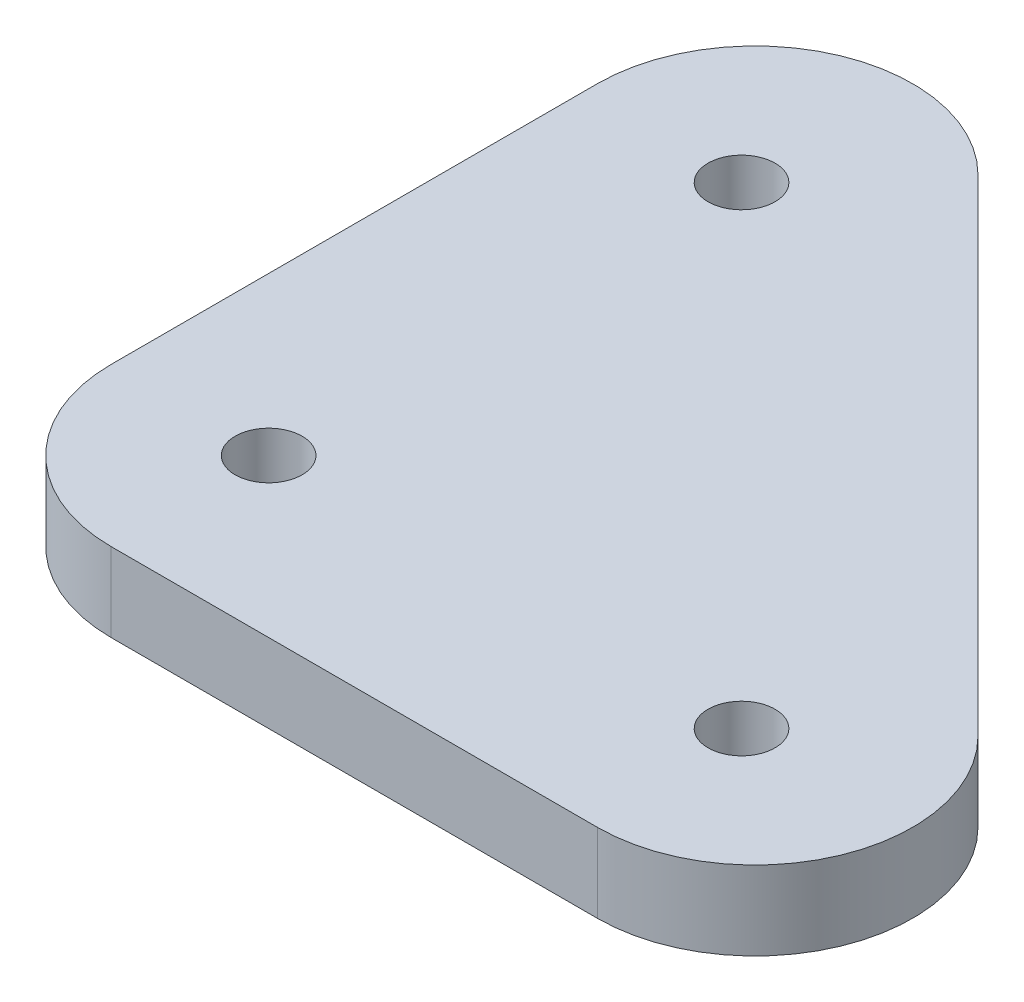
ISO-10303-21;
HEADER;
FILE_DESCRIPTION(('STEP AP214'),'2;1');
FILE_NAME('part.step','',(''),(''),'','','');
FILE_SCHEMA(('AUTOMOTIVE_DESIGN { 1 0 10303 214 1 1 1 1 }'));
ENDSEC;
DATA;
#1=APPLICATION_CONTEXT('core data for automotive mechanical design processes');
#2=APPLICATION_PROTOCOL_DEFINITION('international standard','automotive_design',2000,#1);
#3=PRODUCT_CONTEXT('',#1,'mechanical');
#4=PRODUCT('Part','Part','',(#3));
#5=PRODUCT_RELATED_PRODUCT_CATEGORY('part','',(#4));
#6=PRODUCT_DEFINITION_FORMATION('','',#4);
#7=PRODUCT_DEFINITION_CONTEXT('part definition',#1,'design');
#8=PRODUCT_DEFINITION('design','',#6,#7);
#9=PRODUCT_DEFINITION_SHAPE('','',#8);
#10=(LENGTH_UNIT() NAMED_UNIT(*) SI_UNIT(.MILLI.,.METRE.));
#11=(NAMED_UNIT(*) PLANE_ANGLE_UNIT() SI_UNIT($,.RADIAN.));
#12=(NAMED_UNIT(*) SI_UNIT($,.STERADIAN.) SOLID_ANGLE_UNIT());
#13=UNCERTAINTY_MEASURE_WITH_UNIT(LENGTH_MEASURE(1.E-05),#10,'distance_accuracy_value','');
#14=(GEOMETRIC_REPRESENTATION_CONTEXT(3) GLOBAL_UNCERTAINTY_ASSIGNED_CONTEXT((#13)) GLOBAL_UNIT_ASSIGNED_CONTEXT((#10,
#11,#12)) REPRESENTATION_CONTEXT('',''));
#15=CARTESIAN_POINT('',(0.,0.,0.));
#16=DIRECTION('',(0.,0.,1.));
#17=DIRECTION('',(1.,0.,0.));
#18=AXIS2_PLACEMENT_3D('',#15,#16,#17);
#19=CARTESIAN_POINT('',(40.857864376269,5.,-10.));
#20=DIRECTION('',(0.,-1.,0.));
#21=DIRECTION('',(0.,0.,-1.));
#22=AXIS2_PLACEMENT_3D('',#19,#20,#21);
#23=PLANE('',#22);
#24=CARTESIAN_POINT('',(40.857864376269,5.,-10.));
#25=DIRECTION('',(0.,1.,0.));
#26=DIRECTION('',(0.,0.,-1.));
#27=AXIS2_PLACEMENT_3D('',#24,#25,#26);
#28=CIRCLE('',#27,10.);
#29=CARTESIAN_POINT('',(40.857864376269,5.,0.));
#30=VERTEX_POINT('',#29);
#31=CARTESIAN_POINT('',(47.9289321881345,5.,-17.0710678118655));
#32=VERTEX_POINT('',#31);
#33=EDGE_CURVE('E129',#30,#32,#28,.T.);
#34=ORIENTED_EDGE('',*,*,#33,.T.);
#35=DIRECTION('',(-0.707106781186547,0.,-0.707106781186547));
#36=VECTOR('',#35,1.);
#37=CARTESIAN_POINT('',(17.0710678118655,5.,-47.9289321881345));
#38=LINE('',#37,#36);
#39=CARTESIAN_POINT('',(17.0710678118655,5.,-47.9289321881345));
#40=VERTEX_POINT('',#39);
#41=EDGE_CURVE('E87',#32,#40,#38,.T.);
#42=ORIENTED_EDGE('',*,*,#41,.T.);
#43=CARTESIAN_POINT('',(10.,5.,-40.857864376269));
#44=DIRECTION('',(0.,1.,0.));
#45=DIRECTION('',(0.,0.,-1.));
#46=AXIS2_PLACEMENT_3D('',#43,#44,#45);
#47=CIRCLE('',#46,10.);
#48=CARTESIAN_POINT('',(0.,5.,-40.857864376269));
#49=VERTEX_POINT('',#48);
#50=EDGE_CURVE('E100',#40,#49,#47,.T.);
#51=ORIENTED_EDGE('',*,*,#50,.T.);
#52=DIRECTION('',(0.,0.,1.));
#53=VECTOR('',#52,1.);
#54=CARTESIAN_POINT('',(0.,5.,-9.99999999999999));
#55=LINE('',#54,#53);
#56=CARTESIAN_POINT('',(0.,5.,-9.99999999999999));
#57=VERTEX_POINT('',#56);
#58=EDGE_CURVE('E94',#49,#57,#55,.T.);
#59=ORIENTED_EDGE('',*,*,#58,.T.);
#60=CARTESIAN_POINT('',(10.,5.,-9.99999999999999));
#61=DIRECTION('',(0.,1.,0.));
#62=DIRECTION('',(0.,0.,1.));
#63=AXIS2_PLACEMENT_3D('',#60,#61,#62);
#64=CIRCLE('',#63,10.);
#65=CARTESIAN_POINT('',(10.,5.,0.));
#66=VERTEX_POINT('',#65);
#67=EDGE_CURVE('E98',#57,#66,#64,.T.);
#68=ORIENTED_EDGE('',*,*,#67,.T.);
#69=DIRECTION('',(1.,0.,0.));
#70=VECTOR('',#69,1.);
#71=CARTESIAN_POINT('',(40.857864376269,5.,0.));
#72=LINE('',#71,#70);
#73=EDGE_CURVE('E50',#66,#30,#72,.T.);
#74=ORIENTED_EDGE('',*,*,#73,.T.);
#75=EDGE_LOOP('',(#34,#42,#51,#59,#68,#74));
#76=FACE_BOUND('',#75,.T.);
#77=CARTESIAN_POINT('',(10.,5.,-10.));
#78=DIRECTION('',(0.,1.,0.));
#79=DIRECTION('',(0.,0.,1.));
#80=AXIS2_PLACEMENT_3D('',#77,#78,#79);
#81=CIRCLE('',#80,2.125);
#82=CARTESIAN_POINT('',(10.,5.,-7.875));
#83=VERTEX_POINT('',#82);
#84=EDGE_CURVE('E122',#83,#83,#81,.T.);
#85=ORIENTED_EDGE('',*,*,#84,.F.);
#86=EDGE_LOOP('',(#85));
#87=FACE_BOUND('',#86,.T.);
#88=CARTESIAN_POINT('',(10.,5.,-40.));
#89=DIRECTION('',(0.,1.,0.));
#90=DIRECTION('',(0.,0.,1.));
#91=AXIS2_PLACEMENT_3D('',#88,#89,#90);
#92=CIRCLE('',#91,2.125);
#93=CARTESIAN_POINT('',(10.,5.,-37.875));
#94=VERTEX_POINT('',#93);
#95=EDGE_CURVE('E183',#94,#94,#92,.T.);
#96=ORIENTED_EDGE('',*,*,#95,.F.);
#97=EDGE_LOOP('',(#96));
#98=FACE_BOUND('',#97,.T.);
#99=CARTESIAN_POINT('',(40.,5.,-10.));
#100=DIRECTION('',(0.,1.,0.));
#101=DIRECTION('',(0.,0.,1.));
#102=AXIS2_PLACEMENT_3D('',#99,#100,#101);
#103=CIRCLE('',#102,2.125);
#104=CARTESIAN_POINT('',(40.,5.,-7.87499999999999));
#105=VERTEX_POINT('',#104);
#106=EDGE_CURVE('E174',#105,#105,#103,.T.);
#107=ORIENTED_EDGE('',*,*,#106,.F.);
#108=EDGE_LOOP('',(#107));
#109=FACE_BOUND('',#108,.T.);
#110=ADVANCED_FACE('F33',(#76,#87,#98,#109),#23,.F.);
#111=CARTESIAN_POINT('',(40.857864376269,0.,-10.));
#112=DIRECTION('',(0.,-1.,0.));
#113=DIRECTION('',(0.,0.,-1.));
#114=AXIS2_PLACEMENT_3D('',#111,#112,#113);
#115=PLANE('',#114);
#116=CARTESIAN_POINT('',(10.,0.,-40.));
#117=DIRECTION('',(0.,1.,0.));
#118=DIRECTION('',(0.,0.,1.));
#119=AXIS2_PLACEMENT_3D('',#116,#117,#118);
#120=CIRCLE('',#119,2.125);
#121=CARTESIAN_POINT('',(10.,0.,-37.875));
#122=VERTEX_POINT('',#121);
#123=EDGE_CURVE('E180',#122,#122,#120,.T.);
#124=ORIENTED_EDGE('',*,*,#123,.T.);
#125=EDGE_LOOP('',(#124));
#126=FACE_BOUND('',#125,.T.);
#127=CARTESIAN_POINT('',(40.857864376269,0.,-10.));
#128=DIRECTION('',(0.,1.,0.));
#129=DIRECTION('',(0.,0.,-1.));
#130=AXIS2_PLACEMENT_3D('',#127,#128,#129);
#131=CIRCLE('',#130,10.);
#132=CARTESIAN_POINT('',(40.857864376269,0.,0.));
#133=VERTEX_POINT('',#132);
#134=CARTESIAN_POINT('',(47.9289321881345,0.,-17.0710678118655));
#135=VERTEX_POINT('',#134);
#136=EDGE_CURVE('E118',#133,#135,#131,.T.);
#137=ORIENTED_EDGE('',*,*,#136,.F.);
#138=DIRECTION('',(1.,0.,0.));
#139=VECTOR('',#138,1.);
#140=CARTESIAN_POINT('',(40.857864376269,0.,0.));
#141=LINE('',#140,#139);
#142=CARTESIAN_POINT('',(10.,0.,0.));
#143=VERTEX_POINT('',#142);
#144=EDGE_CURVE('E79',#143,#133,#141,.T.);
#145=ORIENTED_EDGE('',*,*,#144,.F.);
#146=CARTESIAN_POINT('',(10.,0.,-9.99999999999999));
#147=DIRECTION('',(0.,1.,0.));
#148=DIRECTION('',(0.,0.,1.));
#149=AXIS2_PLACEMENT_3D('',#146,#147,#148);
#150=CIRCLE('',#149,10.);
#151=CARTESIAN_POINT('',(0.,0.,-9.99999999999999));
#152=VERTEX_POINT('',#151);
#153=EDGE_CURVE('E73',#152,#143,#150,.T.);
#154=ORIENTED_EDGE('',*,*,#153,.F.);
#155=DIRECTION('',(0.,0.,1.));
#156=VECTOR('',#155,1.);
#157=CARTESIAN_POINT('',(0.,0.,-9.99999999999999));
#158=LINE('',#157,#156);
#159=CARTESIAN_POINT('',(0.,0.,-40.857864376269));
#160=VERTEX_POINT('',#159);
#161=EDGE_CURVE('E108',#160,#152,#158,.T.);
#162=ORIENTED_EDGE('',*,*,#161,.F.);
#163=CARTESIAN_POINT('',(10.,0.,-40.857864376269));
#164=DIRECTION('',(0.,1.,0.));
#165=DIRECTION('',(0.,0.,-1.));
#166=AXIS2_PLACEMENT_3D('',#163,#164,#165);
#167=CIRCLE('',#166,10.);
#168=CARTESIAN_POINT('',(17.0710678118655,0.,-47.9289321881345));
#169=VERTEX_POINT('',#168);
#170=EDGE_CURVE('E124',#169,#160,#167,.T.);
#171=ORIENTED_EDGE('',*,*,#170,.F.);
#172=DIRECTION('',(-0.707106781186547,0.,-0.707106781186547));
#173=VECTOR('',#172,1.);
#174=CARTESIAN_POINT('',(17.0710678118655,0.,-47.9289321881345));
#175=LINE('',#174,#173);
#176=EDGE_CURVE('E121',#135,#169,#175,.T.);
#177=ORIENTED_EDGE('',*,*,#176,.F.);
#178=EDGE_LOOP('',(#137,#145,#154,#162,#171,#177));
#179=FACE_BOUND('',#178,.T.);
#180=CARTESIAN_POINT('',(10.,0.,-10.));
#181=DIRECTION('',(0.,1.,0.));
#182=DIRECTION('',(0.,0.,1.));
#183=AXIS2_PLACEMENT_3D('',#180,#181,#182);
#184=CIRCLE('',#183,2.125);
#185=CARTESIAN_POINT('',(10.,0.,-7.875));
#186=VERTEX_POINT('',#185);
#187=EDGE_CURVE('E186',#186,#186,#184,.T.);
#188=ORIENTED_EDGE('',*,*,#187,.T.);
#189=EDGE_LOOP('',(#188));
#190=FACE_BOUND('',#189,.T.);
#191=CARTESIAN_POINT('',(40.,0.,-10.));
#192=DIRECTION('',(0.,1.,0.));
#193=DIRECTION('',(0.,0.,1.));
#194=AXIS2_PLACEMENT_3D('',#191,#192,#193);
#195=CIRCLE('',#194,2.125);
#196=CARTESIAN_POINT('',(40.,0.,-7.87499999999999));
#197=VERTEX_POINT('',#196);
#198=EDGE_CURVE('E177',#197,#197,#195,.T.);
#199=ORIENTED_EDGE('',*,*,#198,.T.);
#200=EDGE_LOOP('',(#199));
#201=FACE_BOUND('',#200,.T.);
#202=ADVANCED_FACE('F138',(#126,#179,#190,#201),#115,.T.);
#203=CARTESIAN_POINT('',(40.857864376269,5.,-10.));
#204=DIRECTION('',(0.,-1.,0.));
#205=DIRECTION('',(0.,0.,-1.));
#206=AXIS2_PLACEMENT_3D('',#203,#204,#205);
#207=CYLINDRICAL_SURFACE('',#206,10.);
#208=ORIENTED_EDGE('',*,*,#136,.T.);
#209=DIRECTION('',(0.,-1.,0.));
#210=VECTOR('',#209,1.);
#211=CARTESIAN_POINT('',(47.9289321881345,5.,-17.0710678118655));
#212=LINE('',#211,#210);
#213=EDGE_CURVE('E11',#32,#135,#212,.T.);
#214=ORIENTED_EDGE('',*,*,#213,.F.);
#215=ORIENTED_EDGE('',*,*,#33,.F.);
#216=DIRECTION('',(0.,-1.,0.));
#217=VECTOR('',#216,1.);
#218=CARTESIAN_POINT('',(40.857864376269,5.,0.));
#219=LINE('',#218,#217);
#220=EDGE_CURVE('E114',#30,#133,#219,.T.);
#221=ORIENTED_EDGE('',*,*,#220,.T.);
#222=EDGE_LOOP('',(#208,#214,#215,#221));
#223=FACE_BOUND('',#222,.T.);
#224=ADVANCED_FACE('F35',(#223),#207,.T.);
#225=CARTESIAN_POINT('',(17.0710678118655,5.,-47.9289321881345));
#226=DIRECTION('',(-0.707106781186548,0.,0.707106781186548));
#227=DIRECTION('',(0.707106781186548,0.,0.707106781186548));
#228=AXIS2_PLACEMENT_3D('',#225,#226,#227);
#229=PLANE('',#228);
#230=ORIENTED_EDGE('',*,*,#176,.T.);
#231=DIRECTION('',(0.,-1.,0.));
#232=VECTOR('',#231,1.);
#233=CARTESIAN_POINT('',(17.0710678118655,5.,-47.9289321881345));
#234=LINE('',#233,#232);
#235=EDGE_CURVE('E42',#40,#169,#234,.T.);
#236=ORIENTED_EDGE('',*,*,#235,.F.);
#237=ORIENTED_EDGE('',*,*,#41,.F.);
#238=ORIENTED_EDGE('',*,*,#213,.T.);
#239=EDGE_LOOP('',(#230,#236,#237,#238));
#240=FACE_BOUND('',#239,.T.);
#241=ADVANCED_FACE('F237',(#240),#229,.F.);
#242=CARTESIAN_POINT('',(10.,5.,-40.857864376269));
#243=DIRECTION('',(0.,-1.,0.));
#244=DIRECTION('',(0.,0.,-1.));
#245=AXIS2_PLACEMENT_3D('',#242,#243,#244);
#246=CYLINDRICAL_SURFACE('',#245,10.);
#247=ORIENTED_EDGE('',*,*,#170,.T.);
#248=DIRECTION('',(0.,-1.,0.));
#249=VECTOR('',#248,1.);
#250=CARTESIAN_POINT('',(0.,5.,-40.857864376269));
#251=LINE('',#250,#249);
#252=EDGE_CURVE('E109',#49,#160,#251,.T.);
#253=ORIENTED_EDGE('',*,*,#252,.F.);
#254=ORIENTED_EDGE('',*,*,#50,.F.);
#255=ORIENTED_EDGE('',*,*,#235,.T.);
#256=EDGE_LOOP('',(#247,#253,#254,#255));
#257=FACE_BOUND('',#256,.T.);
#258=ADVANCED_FACE('F135',(#257),#246,.T.);
#259=CARTESIAN_POINT('',(0.,5.,-9.99999999999999));
#260=DIRECTION('',(1.,0.,0.));
#261=DIRECTION('',(0.,0.,-1.));
#262=AXIS2_PLACEMENT_3D('',#259,#260,#261);
#263=PLANE('',#262);
#264=ORIENTED_EDGE('',*,*,#161,.T.);
#265=DIRECTION('',(0.,-1.,0.));
#266=VECTOR('',#265,1.);
#267=CARTESIAN_POINT('',(0.,5.,-9.99999999999999));
#268=LINE('',#267,#266);
#269=EDGE_CURVE('E105',#57,#152,#268,.T.);
#270=ORIENTED_EDGE('',*,*,#269,.F.);
#271=ORIENTED_EDGE('',*,*,#58,.F.);
#272=ORIENTED_EDGE('',*,*,#252,.T.);
#273=EDGE_LOOP('',(#264,#270,#271,#272));
#274=FACE_BOUND('',#273,.T.);
#275=ADVANCED_FACE('F106',(#274),#263,.F.);
#276=CARTESIAN_POINT('',(10.,5.,-9.99999999999999));
#277=DIRECTION('',(0.,-1.,0.));
#278=DIRECTION('',(0.,0.,-1.));
#279=AXIS2_PLACEMENT_3D('',#276,#277,#278);
#280=CYLINDRICAL_SURFACE('',#279,10.);
#281=ORIENTED_EDGE('',*,*,#153,.T.);
#282=DIRECTION('',(0.,-1.,0.));
#283=VECTOR('',#282,1.);
#284=CARTESIAN_POINT('',(10.,5.,0.));
#285=LINE('',#284,#283);
#286=EDGE_CURVE('E110',#66,#143,#285,.T.);
#287=ORIENTED_EDGE('',*,*,#286,.F.);
#288=ORIENTED_EDGE('',*,*,#67,.F.);
#289=ORIENTED_EDGE('',*,*,#269,.T.);
#290=EDGE_LOOP('',(#281,#287,#288,#289));
#291=FACE_BOUND('',#290,.T.);
#292=ADVANCED_FACE('F112',(#291),#280,.T.);
#293=CARTESIAN_POINT('',(40.857864376269,5.,0.));
#294=DIRECTION('',(0.,0.,-1.));
#295=DIRECTION('',(-1.,0.,0.));
#296=AXIS2_PLACEMENT_3D('',#293,#294,#295);
#297=PLANE('',#296);
#298=ORIENTED_EDGE('',*,*,#144,.T.);
#299=ORIENTED_EDGE('',*,*,#220,.F.);
#300=ORIENTED_EDGE('',*,*,#73,.F.);
#301=ORIENTED_EDGE('',*,*,#286,.T.);
#302=EDGE_LOOP('',(#298,#299,#300,#301));
#303=FACE_BOUND('',#302,.T.);
#304=ADVANCED_FACE('F143',(#303),#297,.F.);
#305=CARTESIAN_POINT('',(10.,5.,-10.));
#306=DIRECTION('',(0.,-1.,0.));
#307=DIRECTION('',(0.,0.,-1.));
#308=AXIS2_PLACEMENT_3D('',#305,#306,#307);
#309=CYLINDRICAL_SURFACE('',#308,2.125);
#310=ORIENTED_EDGE('',*,*,#84,.T.);
#311=EDGE_LOOP('',(#310));
#312=FACE_BOUND('',#311,.T.);
#313=ORIENTED_EDGE('',*,*,#187,.F.);
#314=EDGE_LOOP('',(#313));
#315=FACE_BOUND('',#314,.T.);
#316=ADVANCED_FACE('F145',(#312,#315),#309,.F.);
#317=CARTESIAN_POINT('',(10.,5.,-40.));
#318=DIRECTION('',(0.,-1.,0.));
#319=DIRECTION('',(0.,0.,-1.));
#320=AXIS2_PLACEMENT_3D('',#317,#318,#319);
#321=CYLINDRICAL_SURFACE('',#320,2.125);
#322=ORIENTED_EDGE('',*,*,#95,.T.);
#323=EDGE_LOOP('',(#322));
#324=FACE_BOUND('',#323,.T.);
#325=ORIENTED_EDGE('',*,*,#123,.F.);
#326=EDGE_LOOP('',(#325));
#327=FACE_BOUND('',#326,.T.);
#328=ADVANCED_FACE('F151',(#324,#327),#321,.F.);
#329=CARTESIAN_POINT('',(40.,5.,-10.));
#330=DIRECTION('',(0.,-1.,0.));
#331=DIRECTION('',(0.,0.,-1.));
#332=AXIS2_PLACEMENT_3D('',#329,#330,#331);
#333=CYLINDRICAL_SURFACE('',#332,2.125);
#334=ORIENTED_EDGE('',*,*,#106,.T.);
#335=EDGE_LOOP('',(#334));
#336=FACE_BOUND('',#335,.T.);
#337=ORIENTED_EDGE('',*,*,#198,.F.);
#338=EDGE_LOOP('',(#337));
#339=FACE_BOUND('',#338,.T.);
#340=ADVANCED_FACE('F165',(#336,#339),#333,.F.);
#341=CLOSED_SHELL('',(#110,#202,#224,#241,#258,#275,#292,#304,#316,#328,#340));
#342=MANIFOLD_SOLID_BREP('B2',#341);
#343=ADVANCED_BREP_SHAPE_REPRESENTATION('',(#18,#342),#14);
#344=SHAPE_DEFINITION_REPRESENTATION(#9,#343);
ENDSEC;
END-ISO-10303-21;
